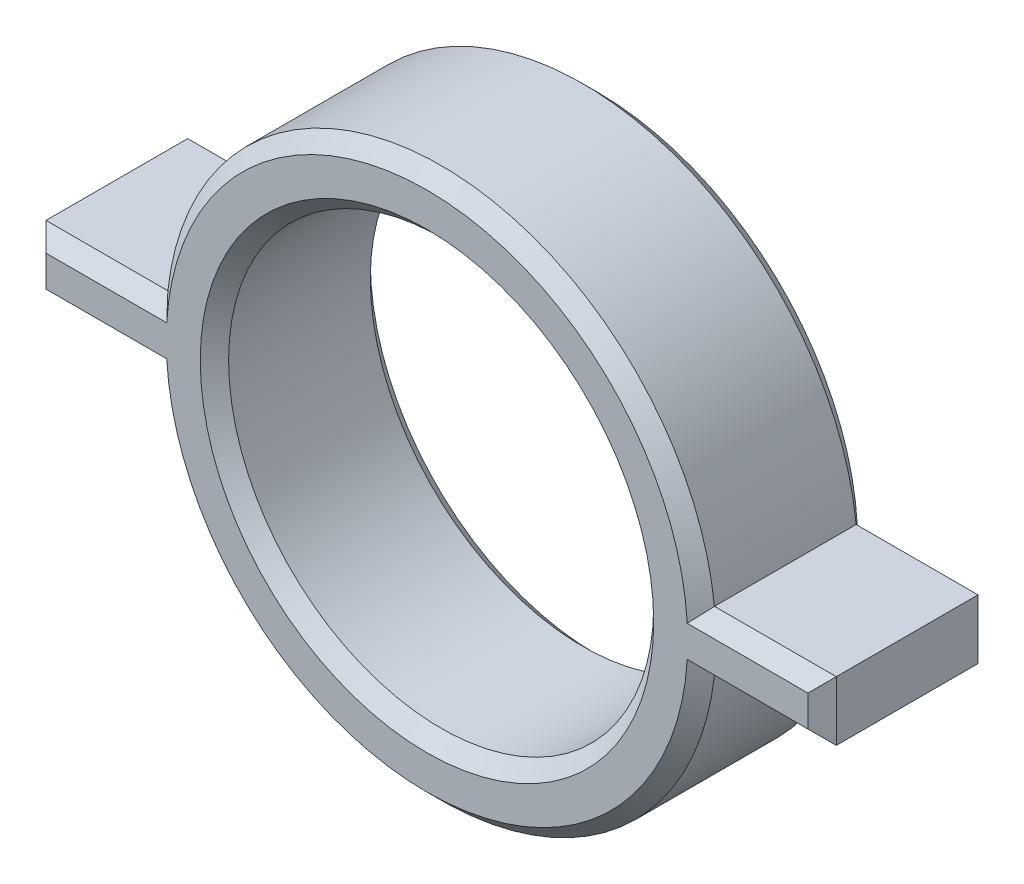
ISO-10303-21;
HEADER;
FILE_DESCRIPTION(('STEP AP214'),'2;1');
FILE_NAME('part.step','',(''),(''),'','','');
FILE_SCHEMA(('AUTOMOTIVE_DESIGN { 1 0 10303 214 1 1 1 1 }'));
ENDSEC;
DATA;
#1=APPLICATION_CONTEXT('core data for automotive mechanical design processes');
#2=APPLICATION_PROTOCOL_DEFINITION('international standard','automotive_design',2000,#1);
#3=PRODUCT_CONTEXT('',#1,'mechanical');
#4=PRODUCT('Part','Part','',(#3));
#5=PRODUCT_RELATED_PRODUCT_CATEGORY('part','',(#4));
#6=PRODUCT_DEFINITION_FORMATION('','',#4);
#7=PRODUCT_DEFINITION_CONTEXT('part definition',#1,'design');
#8=PRODUCT_DEFINITION('design','',#6,#7);
#9=PRODUCT_DEFINITION_SHAPE('','',#8);
#10=(LENGTH_UNIT() NAMED_UNIT(*) SI_UNIT(.MILLI.,.METRE.));
#11=(NAMED_UNIT(*) PLANE_ANGLE_UNIT() SI_UNIT($,.RADIAN.));
#12=(NAMED_UNIT(*) SI_UNIT($,.STERADIAN.) SOLID_ANGLE_UNIT());
#13=UNCERTAINTY_MEASURE_WITH_UNIT(LENGTH_MEASURE(1.E-05),#10,'distance_accuracy_value','');
#14=(GEOMETRIC_REPRESENTATION_CONTEXT(3) GLOBAL_UNCERTAINTY_ASSIGNED_CONTEXT((#13)) GLOBAL_UNIT_ASSIGNED_CONTEXT((#10,
#11,#12)) REPRESENTATION_CONTEXT('',''));
#15=CARTESIAN_POINT('',(0.,0.,0.));
#16=DIRECTION('',(0.,0.,1.));
#17=DIRECTION('',(1.,0.,0.));
#18=AXIS2_PLACEMENT_3D('',#15,#16,#17);
#19=CARTESIAN_POINT('',(0.,0.,6.));
#20=DIRECTION('',(0.,0.,1.));
#21=DIRECTION('',(1.,0.,0.));
#22=AXIS2_PLACEMENT_3D('',#19,#20,#21);
#23=PLANE('',#22);
#24=CARTESIAN_POINT('',(0.,0.,6.));
#25=DIRECTION('',(0.,0.,1.));
#26=DIRECTION('',(1.,0.,0.));
#27=AXIS2_PLACEMENT_3D('',#24,#25,#26);
#28=CIRCLE('',#27,8.00000000000001);
#29=CARTESIAN_POINT('',(8.00000000000001,0.,6.));
#30=VERTEX_POINT('',#29);
#31=EDGE_CURVE('E182',#30,#30,#28,.F.);
#32=ORIENTED_EDGE('',*,*,#31,.T.);
#33=EDGE_LOOP('',(#32));
#34=FACE_BOUND('',#33,.T.);
#35=DIRECTION('',(-1.,0.,0.));
#36=VECTOR('',#35,1.);
#37=CARTESIAN_POINT('',(9.6430026444049,0.550000000000006,6.));
#38=LINE('',#37,#36);
#39=CARTESIAN_POINT('',(13.4430026444049,0.550000000000006,6.));
#40=VERTEX_POINT('',#39);
#41=CARTESIAN_POINT('',(9.18354506712958,0.550000000000006,6.));
#42=VERTEX_POINT('',#41);
#43=EDGE_CURVE('E180',#40,#42,#38,.T.);
#44=ORIENTED_EDGE('',*,*,#43,.T.);
#45=CARTESIAN_POINT('',(0.,0.,6.));
#46=DIRECTION('',(0.,0.,1.));
#47=DIRECTION('',(1.,0.,0.));
#48=AXIS2_PLACEMENT_3D('',#45,#46,#47);
#49=CIRCLE('',#48,9.2);
#50=CARTESIAN_POINT('',(-9.18354506712958,0.550000000000004,6.));
#51=VERTEX_POINT('',#50);
#52=EDGE_CURVE('E162',#42,#51,#49,.T.);
#53=ORIENTED_EDGE('',*,*,#52,.T.);
#54=DIRECTION('',(-1.,0.,0.));
#55=VECTOR('',#54,1.);
#56=CARTESIAN_POINT('',(-13.9430026444049,0.550000000000003,6.));
#57=LINE('',#56,#55);
#58=CARTESIAN_POINT('',(-13.4430026444049,0.550000000000003,6.));
#59=VERTEX_POINT('',#58);
#60=EDGE_CURVE('E170',#51,#59,#57,.T.);
#61=ORIENTED_EDGE('',*,*,#60,.T.);
#62=DIRECTION('',(0.,-1.,0.));
#63=VECTOR('',#62,1.);
#64=CARTESIAN_POINT('',(-13.4430026444049,-1.05,6.));
#65=LINE('',#64,#63);
#66=CARTESIAN_POINT('',(-13.4430026444049,-0.550000000000003,6.));
#67=VERTEX_POINT('',#66);
#68=EDGE_CURVE('E176',#59,#67,#65,.T.);
#69=ORIENTED_EDGE('',*,*,#68,.T.);
#70=DIRECTION('',(1.,0.,0.));
#71=VECTOR('',#70,1.);
#72=CARTESIAN_POINT('',(-9.6430026444049,-0.550000000000004,6.));
#73=LINE('',#72,#71);
#74=CARTESIAN_POINT('',(-9.18354506712958,-0.550000000000004,6.));
#75=VERTEX_POINT('',#74);
#76=EDGE_CURVE('E445',#67,#75,#73,.T.);
#77=ORIENTED_EDGE('',*,*,#76,.T.);
#78=CARTESIAN_POINT('',(0.,0.,6.));
#79=DIRECTION('',(0.,0.,1.));
#80=DIRECTION('',(1.,0.,0.));
#81=AXIS2_PLACEMENT_3D('',#78,#79,#80);
#82=CIRCLE('',#81,9.2);
#83=CARTESIAN_POINT('',(9.18354506712958,-0.550000000000007,6.));
#84=VERTEX_POINT('',#83);
#85=EDGE_CURVE('E447',#75,#84,#82,.T.);
#86=ORIENTED_EDGE('',*,*,#85,.T.);
#87=DIRECTION('',(1.,0.,0.));
#88=VECTOR('',#87,1.);
#89=CARTESIAN_POINT('',(13.9430026444049,-0.55,6.));
#90=LINE('',#89,#88);
#91=CARTESIAN_POINT('',(13.4430026444049,-0.55,6.));
#92=VERTEX_POINT('',#91);
#93=EDGE_CURVE('E449',#84,#92,#90,.T.);
#94=ORIENTED_EDGE('',*,*,#93,.T.);
#95=DIRECTION('',(0.,1.,0.));
#96=VECTOR('',#95,1.);
#97=CARTESIAN_POINT('',(13.4430026444049,1.05,6.));
#98=LINE('',#97,#96);
#99=EDGE_CURVE('E187',#92,#40,#98,.T.);
#100=ORIENTED_EDGE('',*,*,#99,.T.);
#101=EDGE_LOOP('',(#44,#53,#61,#69,#77,#86,#94,#100));
#102=FACE_BOUND('',#101,.T.);
#103=ADVANCED_FACE('F41',(#34,#102),#23,.T.);
#104=CARTESIAN_POINT('',(0.,0.,0.));
#105=DIRECTION('',(0.,0.,1.));
#106=DIRECTION('',(1.,0.,0.));
#107=AXIS2_PLACEMENT_3D('',#104,#105,#106);
#108=PLANE('',#107);
#109=CARTESIAN_POINT('',(0.,0.,0.));
#110=DIRECTION('',(0.,0.,1.));
#111=DIRECTION('',(1.,0.,0.));
#112=AXIS2_PLACEMENT_3D('',#109,#110,#111);
#113=CIRCLE('',#112,7.99999999999999);
#114=CARTESIAN_POINT('',(7.99999999999999,0.,0.));
#115=VERTEX_POINT('',#114);
#116=EDGE_CURVE('E11',#115,#115,#113,.T.);
#117=ORIENTED_EDGE('',*,*,#116,.T.);
#118=EDGE_LOOP('',(#117));
#119=FACE_BOUND('',#118,.T.);
#120=DIRECTION('',(-1.,0.,0.));
#121=VECTOR('',#120,1.);
#122=CARTESIAN_POINT('',(0.,-0.550000000000005,0.));
#123=LINE('',#122,#121);
#124=CARTESIAN_POINT('',(-9.18354506712958,-0.550000000000004,0.));
#125=VERTEX_POINT('',#124);
#126=CARTESIAN_POINT('',(-13.4430026444049,-0.550000000000003,0.));
#127=VERTEX_POINT('',#126);
#128=EDGE_CURVE('E59',#125,#127,#123,.T.);
#129=ORIENTED_EDGE('',*,*,#128,.T.);
#130=DIRECTION('',(0.,1.,0.));
#131=VECTOR('',#130,1.);
#132=CARTESIAN_POINT('',(-13.4430026444049,0.,0.));
#133=LINE('',#132,#131);
#134=CARTESIAN_POINT('',(-13.4430026444049,0.550000000000003,0.));
#135=VERTEX_POINT('',#134);
#136=EDGE_CURVE('E51',#127,#135,#133,.T.);
#137=ORIENTED_EDGE('',*,*,#136,.T.);
#138=DIRECTION('',(1.,0.,0.));
#139=VECTOR('',#138,1.);
#140=CARTESIAN_POINT('',(0.,0.550000000000005,0.));
#141=LINE('',#140,#139);
#142=CARTESIAN_POINT('',(-9.18354506712958,0.550000000000004,0.));
#143=VERTEX_POINT('',#142);
#144=EDGE_CURVE('E222',#135,#143,#141,.T.);
#145=ORIENTED_EDGE('',*,*,#144,.T.);
#146=CARTESIAN_POINT('',(0.,0.,0.));
#147=DIRECTION('',(0.,0.,1.));
#148=DIRECTION('',(1.,0.,0.));
#149=AXIS2_PLACEMENT_3D('',#146,#147,#148);
#150=CIRCLE('',#149,9.2);
#151=CARTESIAN_POINT('',(9.18354506712958,0.550000000000006,0.));
#152=VERTEX_POINT('',#151);
#153=EDGE_CURVE('E224',#143,#152,#150,.F.);
#154=ORIENTED_EDGE('',*,*,#153,.T.);
#155=DIRECTION('',(1.,0.,0.));
#156=VECTOR('',#155,1.);
#157=CARTESIAN_POINT('',(0.,0.550000000000005,0.));
#158=LINE('',#157,#156);
#159=CARTESIAN_POINT('',(13.4430026444049,0.550000000000006,0.));
#160=VERTEX_POINT('',#159);
#161=EDGE_CURVE('E226',#152,#160,#158,.T.);
#162=ORIENTED_EDGE('',*,*,#161,.T.);
#163=DIRECTION('',(0.,-1.,0.));
#164=VECTOR('',#163,1.);
#165=CARTESIAN_POINT('',(13.4430026444049,0.,0.));
#166=LINE('',#165,#164);
#167=CARTESIAN_POINT('',(13.4430026444049,-0.55,0.));
#168=VERTEX_POINT('',#167);
#169=EDGE_CURVE('E228',#160,#168,#166,.T.);
#170=ORIENTED_EDGE('',*,*,#169,.T.);
#171=DIRECTION('',(-1.,0.,0.));
#172=VECTOR('',#171,1.);
#173=CARTESIAN_POINT('',(0.,-0.55000000000002,0.));
#174=LINE('',#173,#172);
#175=CARTESIAN_POINT('',(9.18354506712958,-0.550000000000007,0.));
#176=VERTEX_POINT('',#175);
#177=EDGE_CURVE('E230',#168,#176,#174,.T.);
#178=ORIENTED_EDGE('',*,*,#177,.T.);
#179=CARTESIAN_POINT('',(0.,0.,0.));
#180=DIRECTION('',(0.,0.,1.));
#181=DIRECTION('',(1.,0.,0.));
#182=AXIS2_PLACEMENT_3D('',#179,#180,#181);
#183=CIRCLE('',#182,9.2);
#184=EDGE_CURVE('E64',#176,#125,#183,.F.);
#185=ORIENTED_EDGE('',*,*,#184,.T.);
#186=EDGE_LOOP('',(#129,#137,#145,#154,#162,#170,#178,#185));
#187=FACE_BOUND('',#186,.T.);
#188=ADVANCED_FACE('F411',(#119,#187),#108,.F.);
#189=CARTESIAN_POINT('',(-9.6430026444049,1.05,6.));
#190=DIRECTION('',(0.,-1.,0.));
#191=DIRECTION('',(1.,0.,0.));
#192=AXIS2_PLACEMENT_3D('',#189,#190,#191);
#193=PLANE('',#192);
#194=DIRECTION('',(0.,0.,-1.));
#195=VECTOR('',#194,1.);
#196=CARTESIAN_POINT('',(-13.9430026444049,1.05,6.));
#197=LINE('',#196,#195);
#198=CARTESIAN_POINT('',(-13.9430026444049,1.05,5.5));
#199=VERTEX_POINT('',#198);
#200=CARTESIAN_POINT('',(-13.9430026444049,1.05,0.499999999999997));
#201=VERTEX_POINT('',#200);
#202=EDGE_CURVE('E426',#199,#201,#197,.T.);
#203=ORIENTED_EDGE('',*,*,#202,.F.);
#204=DIRECTION('',(1.,0.,0.));
#205=VECTOR('',#204,1.);
#206=CARTESIAN_POINT('',(-9.6430026444049,1.05,5.5));
#207=LINE('',#206,#205);
#208=CARTESIAN_POINT('',(-9.6430026444049,1.05,5.5));
#209=VERTEX_POINT('',#208);
#210=EDGE_CURVE('E220',#199,#209,#207,.T.);
#211=ORIENTED_EDGE('',*,*,#210,.T.);
#212=DIRECTION('',(0.,0.,-1.));
#213=VECTOR('',#212,1.);
#214=CARTESIAN_POINT('',(-9.6430026444049,1.05,6.));
#215=LINE('',#214,#213);
#216=CARTESIAN_POINT('',(-9.6430026444049,1.05,0.499999999999997));
#217=VERTEX_POINT('',#216);
#218=EDGE_CURVE('E307',#209,#217,#215,.T.);
#219=ORIENTED_EDGE('',*,*,#218,.T.);
#220=DIRECTION('',(-1.,0.,0.));
#221=VECTOR('',#220,1.);
#222=CARTESIAN_POINT('',(-9.6430026444049,1.05,0.499999999999997));
#223=LINE('',#222,#221);
#224=EDGE_CURVE('E218',#217,#201,#223,.T.);
#225=ORIENTED_EDGE('',*,*,#224,.T.);
#226=EDGE_LOOP('',(#203,#211,#219,#225));
#227=FACE_BOUND('',#226,.T.);
#228=ADVANCED_FACE('F425',(#227),#193,.F.);
#229=CARTESIAN_POINT('',(-13.9430026444049,1.05,6.));
#230=DIRECTION('',(1.,0.,0.));
#231=DIRECTION('',(0.,0.,-1.));
#232=AXIS2_PLACEMENT_3D('',#229,#230,#231);
#233=PLANE('',#232);
#234=DIRECTION('',(0.,0.,-1.));
#235=VECTOR('',#234,1.);
#236=CARTESIAN_POINT('',(-13.9430026444049,-1.05,6.));
#237=LINE('',#236,#235);
#238=CARTESIAN_POINT('',(-13.9430026444049,-1.05,5.5));
#239=VERTEX_POINT('',#238);
#240=CARTESIAN_POINT('',(-13.9430026444049,-1.05,0.499999999999997));
#241=VERTEX_POINT('',#240);
#242=EDGE_CURVE('E434',#239,#241,#237,.T.);
#243=ORIENTED_EDGE('',*,*,#242,.F.);
#244=DIRECTION('',(0.,1.,0.));
#245=VECTOR('',#244,1.);
#246=CARTESIAN_POINT('',(-13.9430026444049,1.05,5.5));
#247=LINE('',#246,#245);
#248=EDGE_CURVE('E216',#239,#199,#247,.T.);
#249=ORIENTED_EDGE('',*,*,#248,.T.);
#250=ORIENTED_EDGE('',*,*,#202,.T.);
#251=DIRECTION('',(0.,-1.,0.));
#252=VECTOR('',#251,1.);
#253=CARTESIAN_POINT('',(-13.9430026444049,1.05,0.499999999999997));
#254=LINE('',#253,#252);
#255=EDGE_CURVE('E213',#201,#241,#254,.T.);
#256=ORIENTED_EDGE('',*,*,#255,.T.);
#257=EDGE_LOOP('',(#243,#249,#250,#256));
#258=FACE_BOUND('',#257,.T.);
#259=ADVANCED_FACE('F430',(#258),#233,.F.);
#260=CARTESIAN_POINT('',(-13.9430026444049,-1.05,6.));
#261=DIRECTION('',(0.,1.,0.));
#262=DIRECTION('',(-1.,0.,0.));
#263=AXIS2_PLACEMENT_3D('',#260,#261,#262);
#264=PLANE('',#263);
#265=DIRECTION('',(0.,0.,-1.));
#266=VECTOR('',#265,1.);
#267=CARTESIAN_POINT('',(-9.6430026444049,-1.05,6.));
#268=LINE('',#267,#266);
#269=CARTESIAN_POINT('',(-9.6430026444049,-1.05,5.5));
#270=VERTEX_POINT('',#269);
#271=CARTESIAN_POINT('',(-9.6430026444049,-1.05,0.499999999999997));
#272=VERTEX_POINT('',#271);
#273=EDGE_CURVE('E438',#270,#272,#268,.T.);
#274=ORIENTED_EDGE('',*,*,#273,.F.);
#275=DIRECTION('',(-1.,0.,0.));
#276=VECTOR('',#275,1.);
#277=CARTESIAN_POINT('',(-13.9430026444049,-1.05,5.5));
#278=LINE('',#277,#276);
#279=EDGE_CURVE('E211',#270,#239,#278,.T.);
#280=ORIENTED_EDGE('',*,*,#279,.T.);
#281=ORIENTED_EDGE('',*,*,#242,.T.);
#282=DIRECTION('',(1.,0.,0.));
#283=VECTOR('',#282,1.);
#284=CARTESIAN_POINT('',(-13.9430026444049,-1.05,0.499999999999997));
#285=LINE('',#284,#283);
#286=EDGE_CURVE('E209',#241,#272,#285,.T.);
#287=ORIENTED_EDGE('',*,*,#286,.T.);
#288=EDGE_LOOP('',(#274,#280,#281,#287));
#289=FACE_BOUND('',#288,.T.);
#290=ADVANCED_FACE('F500',(#289),#264,.F.);
#291=CARTESIAN_POINT('',(0.,0.,6.));
#292=DIRECTION('',(0.,0.,-1.));
#293=DIRECTION('',(-1.,0.,0.));
#294=AXIS2_PLACEMENT_3D('',#291,#292,#293);
#295=CYLINDRICAL_SURFACE('',#294,9.7);
#296=DIRECTION('',(0.,0.,-1.));
#297=VECTOR('',#296,1.);
#298=CARTESIAN_POINT('',(9.6430026444049,-1.05,6.));
#299=LINE('',#298,#297);
#300=CARTESIAN_POINT('',(9.6430026444049,-1.05,5.5));
#301=VERTEX_POINT('',#300);
#302=CARTESIAN_POINT('',(9.6430026444049,-1.05,0.499999999999997));
#303=VERTEX_POINT('',#302);
#304=EDGE_CURVE('E487',#301,#303,#299,.T.);
#305=ORIENTED_EDGE('',*,*,#304,.F.);
#306=CARTESIAN_POINT('',(0.,0.,5.5));
#307=DIRECTION('',(0.,0.,1.));
#308=DIRECTION('',(1.,0.,0.));
#309=AXIS2_PLACEMENT_3D('',#306,#307,#308);
#310=CIRCLE('',#309,9.7);
#311=EDGE_CURVE('E207',#301,#270,#310,.F.);
#312=ORIENTED_EDGE('',*,*,#311,.T.);
#313=ORIENTED_EDGE('',*,*,#273,.T.);
#314=CARTESIAN_POINT('',(0.,0.,0.499999999999997));
#315=DIRECTION('',(0.,0.,1.));
#316=DIRECTION('',(1.,0.,0.));
#317=AXIS2_PLACEMENT_3D('',#314,#315,#316);
#318=CIRCLE('',#317,9.7);
#319=EDGE_CURVE('E205',#272,#303,#318,.T.);
#320=ORIENTED_EDGE('',*,*,#319,.T.);
#321=EDGE_LOOP('',(#305,#312,#313,#320));
#322=FACE_BOUND('',#321,.T.);
#323=ADVANCED_FACE('F494',(#322),#295,.T.);
#324=CARTESIAN_POINT('',(9.6430026444049,-1.05,6.));
#325=DIRECTION('',(0.,1.,0.));
#326=DIRECTION('',(-1.,0.,0.));
#327=AXIS2_PLACEMENT_3D('',#324,#325,#326);
#328=PLANE('',#327);
#329=DIRECTION('',(0.,0.,-1.));
#330=VECTOR('',#329,1.);
#331=CARTESIAN_POINT('',(13.9430026444049,-1.05,6.));
#332=LINE('',#331,#330);
#333=CARTESIAN_POINT('',(13.9430026444049,-1.05,5.5));
#334=VERTEX_POINT('',#333);
#335=CARTESIAN_POINT('',(13.9430026444049,-1.05,0.499999999999997));
#336=VERTEX_POINT('',#335);
#337=EDGE_CURVE('E484',#334,#336,#332,.T.);
#338=ORIENTED_EDGE('',*,*,#337,.F.);
#339=DIRECTION('',(-1.,0.,0.));
#340=VECTOR('',#339,1.);
#341=CARTESIAN_POINT('',(9.6430026444049,-1.05,5.5));
#342=LINE('',#341,#340);
#343=EDGE_CURVE('E203',#334,#301,#342,.T.);
#344=ORIENTED_EDGE('',*,*,#343,.T.);
#345=ORIENTED_EDGE('',*,*,#304,.T.);
#346=DIRECTION('',(1.,0.,0.));
#347=VECTOR('',#346,1.);
#348=CARTESIAN_POINT('',(9.6430026444049,-1.05,0.499999999999997));
#349=LINE('',#348,#347);
#350=EDGE_CURVE('E201',#303,#336,#349,.T.);
#351=ORIENTED_EDGE('',*,*,#350,.T.);
#352=EDGE_LOOP('',(#338,#344,#345,#351));
#353=FACE_BOUND('',#352,.T.);
#354=ADVANCED_FACE('F507',(#353),#328,.F.);
#355=CARTESIAN_POINT('',(13.9430026444049,-1.05,6.));
#356=DIRECTION('',(-1.,0.,0.));
#357=DIRECTION('',(0.,0.,1.));
#358=AXIS2_PLACEMENT_3D('',#355,#356,#357);
#359=PLANE('',#358);
#360=DIRECTION('',(0.,0.,-1.));
#361=VECTOR('',#360,1.);
#362=CARTESIAN_POINT('',(13.9430026444049,1.05,6.));
#363=LINE('',#362,#361);
#364=CARTESIAN_POINT('',(13.9430026444049,1.05,5.5));
#365=VERTEX_POINT('',#364);
#366=CARTESIAN_POINT('',(13.9430026444049,1.05,0.499999999999997));
#367=VERTEX_POINT('',#366);
#368=EDGE_CURVE('E479',#365,#367,#363,.T.);
#369=ORIENTED_EDGE('',*,*,#368,.F.);
#370=DIRECTION('',(0.,-1.,0.));
#371=VECTOR('',#370,1.);
#372=CARTESIAN_POINT('',(13.9430026444049,-1.05,5.5));
#373=LINE('',#372,#371);
#374=EDGE_CURVE('E199',#365,#334,#373,.T.);
#375=ORIENTED_EDGE('',*,*,#374,.T.);
#376=ORIENTED_EDGE('',*,*,#337,.T.);
#377=DIRECTION('',(0.,1.,0.));
#378=VECTOR('',#377,1.);
#379=CARTESIAN_POINT('',(13.9430026444049,-1.05,0.499999999999997));
#380=LINE('',#379,#378);
#381=EDGE_CURVE('E197',#336,#367,#380,.T.);
#382=ORIENTED_EDGE('',*,*,#381,.T.);
#383=EDGE_LOOP('',(#369,#375,#376,#382));
#384=FACE_BOUND('',#383,.T.);
#385=ADVANCED_FACE('F526',(#384),#359,.F.);
#386=CARTESIAN_POINT('',(13.9430026444049,1.05,6.));
#387=DIRECTION('',(0.,-1.,0.));
#388=DIRECTION('',(1.,0.,0.));
#389=AXIS2_PLACEMENT_3D('',#386,#387,#388);
#390=PLANE('',#389);
#391=DIRECTION('',(0.,0.,-1.));
#392=VECTOR('',#391,1.);
#393=CARTESIAN_POINT('',(9.6430026444049,1.05,6.));
#394=LINE('',#393,#392);
#395=CARTESIAN_POINT('',(9.6430026444049,1.05,5.5));
#396=VERTEX_POINT('',#395);
#397=CARTESIAN_POINT('',(9.6430026444049,1.05,0.499999999999997));
#398=VERTEX_POINT('',#397);
#399=EDGE_CURVE('E477',#396,#398,#394,.T.);
#400=ORIENTED_EDGE('',*,*,#399,.F.);
#401=DIRECTION('',(1.,0.,0.));
#402=VECTOR('',#401,1.);
#403=CARTESIAN_POINT('',(13.9430026444049,1.05,5.5));
#404=LINE('',#403,#402);
#405=EDGE_CURVE('E195',#396,#365,#404,.T.);
#406=ORIENTED_EDGE('',*,*,#405,.T.);
#407=ORIENTED_EDGE('',*,*,#368,.T.);
#408=DIRECTION('',(-1.,0.,0.));
#409=VECTOR('',#408,1.);
#410=CARTESIAN_POINT('',(13.9430026444049,1.05,0.499999999999997));
#411=LINE('',#410,#409);
#412=EDGE_CURVE('E193',#367,#398,#411,.T.);
#413=ORIENTED_EDGE('',*,*,#412,.T.);
#414=EDGE_LOOP('',(#400,#406,#407,#413));
#415=FACE_BOUND('',#414,.T.);
#416=ADVANCED_FACE('F523',(#415),#390,.F.);
#417=CARTESIAN_POINT('',(0.,0.,6.));
#418=DIRECTION('',(0.,0.,-1.));
#419=DIRECTION('',(-1.,0.,0.));
#420=AXIS2_PLACEMENT_3D('',#417,#418,#419);
#421=CYLINDRICAL_SURFACE('',#420,9.7);
#422=ORIENTED_EDGE('',*,*,#218,.F.);
#423=CARTESIAN_POINT('',(0.,0.,5.5));
#424=DIRECTION('',(0.,0.,1.));
#425=DIRECTION('',(1.,0.,0.));
#426=AXIS2_PLACEMENT_3D('',#423,#424,#425);
#427=CIRCLE('',#426,9.7);
#428=EDGE_CURVE('E164',#209,#396,#427,.F.);
#429=ORIENTED_EDGE('',*,*,#428,.T.);
#430=ORIENTED_EDGE('',*,*,#399,.T.);
#431=CARTESIAN_POINT('',(0.,0.,0.499999999999997));
#432=DIRECTION('',(0.,0.,1.));
#433=DIRECTION('',(1.,0.,0.));
#434=AXIS2_PLACEMENT_3D('',#431,#432,#433);
#435=CIRCLE('',#434,9.7);
#436=EDGE_CURVE('E185',#398,#217,#435,.T.);
#437=ORIENTED_EDGE('',*,*,#436,.T.);
#438=EDGE_LOOP('',(#422,#429,#430,#437));
#439=FACE_BOUND('',#438,.T.);
#440=ADVANCED_FACE('F474',(#439),#421,.T.);
#441=CARTESIAN_POINT('',(0.,0.,6.));
#442=DIRECTION('',(0.,0.,-1.));
#443=DIRECTION('',(-1.,0.,0.));
#444=AXIS2_PLACEMENT_3D('',#441,#442,#443);
#445=CYLINDRICAL_SURFACE('',#444,7.5);
#446=CARTESIAN_POINT('',(0.,0.,5.49999999999999));
#447=DIRECTION('',(0.,0.,1.));
#448=DIRECTION('',(1.,0.,0.));
#449=AXIS2_PLACEMENT_3D('',#446,#447,#448);
#450=CIRCLE('',#449,7.5);
#451=CARTESIAN_POINT('',(7.5,0.,5.49999999999999));
#452=VERTEX_POINT('',#451);
#453=EDGE_CURVE('E177',#452,#452,#450,.T.);
#454=ORIENTED_EDGE('',*,*,#453,.T.);
#455=EDGE_LOOP('',(#454));
#456=FACE_BOUND('',#455,.T.);
#457=CARTESIAN_POINT('',(0.,0.,0.499999999999992));
#458=DIRECTION('',(0.,0.,1.));
#459=DIRECTION('',(1.,0.,0.));
#460=AXIS2_PLACEMENT_3D('',#457,#458,#459);
#461=CIRCLE('',#460,7.5);
#462=CARTESIAN_POINT('',(7.5,0.,0.499999999999992));
#463=VERTEX_POINT('',#462);
#464=EDGE_CURVE('E433',#463,#463,#461,.F.);
#465=ORIENTED_EDGE('',*,*,#464,.T.);
#466=EDGE_LOOP('',(#465));
#467=FACE_BOUND('',#466,.T.);
#468=ADVANCED_FACE('F519',(#456,#467),#445,.F.);
#469=CARTESIAN_POINT('',(0.,0.,5.49999999999999));
#470=DIRECTION('',(0.,0.,1.));
#471=DIRECTION('',(1.,0.,0.));
#472=AXIS2_PLACEMENT_3D('',#469,#470,#471);
#473=CONICAL_SURFACE('',#472,7.5,0.785398163397449);
#474=ORIENTED_EDGE('',*,*,#31,.F.);
#475=EDGE_LOOP('',(#474));
#476=FACE_BOUND('',#475,.T.);
#477=ORIENTED_EDGE('',*,*,#453,.F.);
#478=EDGE_LOOP('',(#477));
#479=FACE_BOUND('',#478,.T.);
#480=ADVANCED_FACE('F287',(#476,#479),#473,.F.);
#481=CARTESIAN_POINT('',(0.,0.,6.));
#482=DIRECTION('',(0.,0.,-1.));
#483=DIRECTION('',(-1.,0.,0.));
#484=AXIS2_PLACEMENT_3D('',#481,#482,#483);
#485=CONICAL_SURFACE('',#484,9.2,0.785398163397448);
#486=CARTESIAN_POINT('',(-9.6430026444049,-1.05,5.5));
#487=CARTESIAN_POINT('',(-9.56774038324807,-0.96606303608775,5.58393696391225));
#488=CARTESIAN_POINT('',(-9.49182115325673,-0.882427921481516,5.66757207851849));
#489=CARTESIAN_POINT('',(-9.33866862965934,-0.715761253821939,5.83423874617807));
#490=CARTESIAN_POINT('',(-9.26143533389224,-0.632729701761507,5.9172702982385));
#491=CARTESIAN_POINT('',(-9.18354506712958,-0.550000000000002,6.));
#492=B_SPLINE_CURVE_WITH_KNOTS('',3,(#486,#487,#488,#489,#490,#491),.UNSPECIFIED.,.F.,.F.,(4,2,
4),(0.,0.42164030696301,0.843281307402478),.UNSPECIFIED.);
#493=EDGE_CURVE('E293',#270,#75,#492,.T.);
#494=ORIENTED_EDGE('',*,*,#493,.F.);
#495=ORIENTED_EDGE('',*,*,#311,.F.);
#496=CARTESIAN_POINT('',(9.6430026444049,-1.05,5.5));
#497=CARTESIAN_POINT('',(9.56774038324807,-0.966063036087752,5.58393696391225));
#498=CARTESIAN_POINT('',(9.49182115325673,-0.882427921481517,5.66757207851849));
#499=CARTESIAN_POINT('',(9.33866862965934,-0.715761253821941,5.83423874617807));
#500=CARTESIAN_POINT('',(9.26143533389223,-0.63272970176151,5.9172702982385));
#501=CARTESIAN_POINT('',(9.18354506712958,-0.550000000000005,6.));
#502=B_SPLINE_CURVE_WITH_KNOTS('',3,(#496,#497,#498,#499,#500,#501),.UNSPECIFIED.,.F.,.F.,(4,2,
4),(0.,0.421640306963012,0.843281307402478),.UNSPECIFIED.);
#503=EDGE_CURVE('E300',#84,#301,#502,.F.);
#504=ORIENTED_EDGE('',*,*,#503,.F.);
#505=ORIENTED_EDGE('',*,*,#85,.F.);
#506=EDGE_LOOP('',(#494,#495,#504,#505));
#507=FACE_BOUND('',#506,.T.);
#508=ADVANCED_FACE('F279',(#507),#485,.T.);
#509=CARTESIAN_POINT('',(0.,-0.55000000000002,6.));
#510=DIRECTION('',(0.,-0.707106781186547,0.707106781186547));
#511=DIRECTION('',(-1.,0.,0.));
#512=AXIS2_PLACEMENT_3D('',#509,#510,#511);
#513=PLANE('',#512);
#514=ORIENTED_EDGE('',*,*,#503,.T.);
#515=ORIENTED_EDGE('',*,*,#343,.F.);
#516=DIRECTION('',(-0.577350269189626,0.577350269189625,0.577350269189626));
#517=VECTOR('',#516,1.);
#518=CARTESIAN_POINT('',(8.96200176293661,3.93100088146829,10.4810008814683));
#519=LINE('',#518,#517);
#520=EDGE_CURVE('E463',#92,#334,#519,.F.);
#521=ORIENTED_EDGE('',*,*,#520,.F.);
#522=ORIENTED_EDGE('',*,*,#93,.F.);
#523=EDGE_LOOP('',(#514,#515,#521,#522));
#524=FACE_BOUND('',#523,.T.);
#525=ADVANCED_FACE('F286',(#524),#513,.T.);
#526=CARTESIAN_POINT('',(0.,-0.550000000000005,6.));
#527=DIRECTION('',(0.,-0.707106781186547,0.707106781186547));
#528=DIRECTION('',(-1.,0.,0.));
#529=AXIS2_PLACEMENT_3D('',#526,#527,#528);
#530=PLANE('',#529);
#531=ORIENTED_EDGE('',*,*,#493,.T.);
#532=ORIENTED_EDGE('',*,*,#76,.F.);
#533=DIRECTION('',(0.577350269189626,0.577350269189626,0.577350269189626));
#534=VECTOR('',#533,1.);
#535=CARTESIAN_POINT('',(-13.2596693110716,-0.366666666666669,6.18333333333333));
#536=LINE('',#535,#534);
#537=EDGE_CURVE('E459',#239,#67,#536,.T.);
#538=ORIENTED_EDGE('',*,*,#537,.F.);
#539=ORIENTED_EDGE('',*,*,#279,.F.);
#540=EDGE_LOOP('',(#531,#532,#538,#539));
#541=FACE_BOUND('',#540,.T.);
#542=ADVANCED_FACE('F277',(#541),#530,.T.);
#543=CARTESIAN_POINT('',(13.4430026444049,0.,6.));
#544=DIRECTION('',(0.707106781186547,0.,0.707106781186547));
#545=DIRECTION('',(0.,-1.,0.));
#546=AXIS2_PLACEMENT_3D('',#543,#544,#545);
#547=PLANE('',#546);
#548=ORIENTED_EDGE('',*,*,#520,.T.);
#549=ORIENTED_EDGE('',*,*,#374,.F.);
#550=DIRECTION('',(-0.577350269189626,-0.577350269189626,0.577350269189626));
#551=VECTOR('',#550,1.);
#552=CARTESIAN_POINT('',(13.2596693110716,0.366666666666671,6.18333333333334));
#553=LINE('',#552,#551);
#554=EDGE_CURVE('E457',#40,#365,#553,.F.);
#555=ORIENTED_EDGE('',*,*,#554,.F.);
#556=ORIENTED_EDGE('',*,*,#99,.F.);
#557=EDGE_LOOP('',(#548,#549,#555,#556));
#558=FACE_BOUND('',#557,.T.);
#559=ADVANCED_FACE('F270',(#558),#547,.T.);
#560=CARTESIAN_POINT('',(-13.4430026444049,0.,6.));
#561=DIRECTION('',(-0.707106781186547,0.,0.707106781186547));
#562=DIRECTION('',(0.,1.,0.));
#563=AXIS2_PLACEMENT_3D('',#560,#561,#562);
#564=PLANE('',#563);
#565=ORIENTED_EDGE('',*,*,#537,.T.);
#566=ORIENTED_EDGE('',*,*,#68,.F.);
#567=DIRECTION('',(0.577350269189626,-0.577350269189626,0.577350269189626));
#568=VECTOR('',#567,1.);
#569=CARTESIAN_POINT('',(-8.96200176293661,-3.9310008814683,10.4810008814683));
#570=LINE('',#569,#568);
#571=EDGE_CURVE('E173',#199,#59,#570,.T.);
#572=ORIENTED_EDGE('',*,*,#571,.F.);
#573=ORIENTED_EDGE('',*,*,#248,.F.);
#574=EDGE_LOOP('',(#565,#566,#572,#573));
#575=FACE_BOUND('',#574,.T.);
#576=ADVANCED_FACE('F263',(#575),#564,.T.);
#577=CARTESIAN_POINT('',(0.,0.550000000000005,6.));
#578=DIRECTION('',(0.,0.707106781186547,0.707106781186547));
#579=DIRECTION('',(1.,0.,0.));
#580=AXIS2_PLACEMENT_3D('',#577,#578,#579);
#581=PLANE('',#580);
#582=ORIENTED_EDGE('',*,*,#554,.T.);
#583=ORIENTED_EDGE('',*,*,#405,.F.);
#584=CARTESIAN_POINT('',(9.6430026444049,1.05,5.5));
#585=CARTESIAN_POINT('',(9.56774038324807,0.966063036087752,5.58393696391225));
#586=CARTESIAN_POINT('',(9.49182115325673,0.882427921481517,5.66757207851849));
#587=CARTESIAN_POINT('',(9.33866862965934,0.715761253821941,5.83423874617807));
#588=CARTESIAN_POINT('',(9.26143533389223,0.632729701761509,5.9172702982385));
#589=CARTESIAN_POINT('',(9.18354506712958,0.550000000000004,6.));
#590=B_SPLINE_CURVE_WITH_KNOTS('',3,(#584,#585,#586,#587,#588,#589),.UNSPECIFIED.,.F.,.F.,(4,2,
4),(0.,0.421640306963012,0.843281307402479),.UNSPECIFIED.);
#591=EDGE_CURVE('E167',#42,#396,#590,.F.);
#592=ORIENTED_EDGE('',*,*,#591,.F.);
#593=ORIENTED_EDGE('',*,*,#43,.F.);
#594=EDGE_LOOP('',(#582,#583,#592,#593));
#595=FACE_BOUND('',#594,.T.);
#596=ADVANCED_FACE('F256',(#595),#581,.T.);
#597=CARTESIAN_POINT('',(0.,0.550000000000005,6.));
#598=DIRECTION('',(0.,0.707106781186547,0.707106781186547));
#599=DIRECTION('',(1.,0.,0.));
#600=AXIS2_PLACEMENT_3D('',#597,#598,#599);
#601=PLANE('',#600);
#602=ORIENTED_EDGE('',*,*,#571,.T.);
#603=ORIENTED_EDGE('',*,*,#60,.F.);
#604=CARTESIAN_POINT('',(-9.18354506712958,0.550000000000004,6.));
#605=CARTESIAN_POINT('',(-9.26143533389223,0.632729701761509,5.9172702982385));
#606=CARTESIAN_POINT('',(-9.33866862965934,0.71576125382194,5.83423874617806));
#607=CARTESIAN_POINT('',(-9.49182115325673,0.882427921481515,5.66757207851849));
#608=CARTESIAN_POINT('',(-9.56774038324807,0.966063036087749,5.58393696391226));
#609=CARTESIAN_POINT('',(-9.64300264440491,1.05,5.50000000000001));
#610=B_SPLINE_CURVE_WITH_KNOTS('',3,(#604,#605,#606,#607,#608,#609),.UNSPECIFIED.,.F.,.F.,(4,2,
4),(0.,0.421641000439468,0.843281307402478),.UNSPECIFIED.);
#611=EDGE_CURVE('E158',#209,#51,#610,.F.);
#612=ORIENTED_EDGE('',*,*,#611,.F.);
#613=ORIENTED_EDGE('',*,*,#210,.F.);
#614=EDGE_LOOP('',(#602,#603,#612,#613));
#615=FACE_BOUND('',#614,.T.);
#616=ADVANCED_FACE('F171',(#615),#601,.T.);
#617=CARTESIAN_POINT('',(0.,0.,6.));
#618=DIRECTION('',(0.,0.,-1.));
#619=DIRECTION('',(-1.,0.,0.));
#620=AXIS2_PLACEMENT_3D('',#617,#618,#619);
#621=CONICAL_SURFACE('',#620,9.2,0.785398163397448);
#622=ORIENTED_EDGE('',*,*,#591,.T.);
#623=ORIENTED_EDGE('',*,*,#428,.F.);
#624=ORIENTED_EDGE('',*,*,#611,.T.);
#625=ORIENTED_EDGE('',*,*,#52,.F.);
#626=EDGE_LOOP('',(#622,#623,#624,#625));
#627=FACE_BOUND('',#626,.T.);
#628=ADVANCED_FACE('F160',(#627),#621,.T.);
#629=CARTESIAN_POINT('',(0.,0.,0.));
#630=DIRECTION('',(0.,0.,-1.));
#631=DIRECTION('',(-1.,0.,0.));
#632=AXIS2_PLACEMENT_3D('',#629,#630,#631);
#633=CONICAL_SURFACE('',#632,7.99999999999999,0.78539816339745);
#634=ORIENTED_EDGE('',*,*,#464,.F.);
#635=EDGE_LOOP('',(#634));
#636=FACE_BOUND('',#635,.T.);
#637=ORIENTED_EDGE('',*,*,#116,.F.);
#638=EDGE_LOOP('',(#637));
#639=FACE_BOUND('',#638,.T.);
#640=ADVANCED_FACE('F319',(#636,#639),#633,.F.);
#641=CARTESIAN_POINT('',(13.9430026444049,-1.05,0.499999999999997));
#642=DIRECTION('',(-0.707106781186547,0.,0.707106781186547));
#643=DIRECTION('',(0.,1.,0.));
#644=AXIS2_PLACEMENT_3D('',#641,#642,#643);
#645=PLANE('',#644);
#646=DIRECTION('',(-0.577350269189626,0.577350269189625,-0.577350269189626));
#647=VECTOR('',#646,1.);
#648=CARTESIAN_POINT('',(13.9430026444049,-1.05,0.499999999999997));
#649=LINE('',#648,#647);
#650=EDGE_CURVE('E398',#168,#336,#649,.F.);
#651=ORIENTED_EDGE('',*,*,#650,.F.);
#652=ORIENTED_EDGE('',*,*,#169,.F.);
#653=DIRECTION('',(-0.577350269189626,-0.577350269189626,-0.577350269189626));
#654=VECTOR('',#653,1.);
#655=CARTESIAN_POINT('',(13.9430026444049,1.05,0.499999999999997));
#656=LINE('',#655,#654);
#657=EDGE_CURVE('E46',#367,#160,#656,.T.);
#658=ORIENTED_EDGE('',*,*,#657,.F.);
#659=ORIENTED_EDGE('',*,*,#381,.F.);
#660=EDGE_LOOP('',(#651,#652,#658,#659));
#661=FACE_BOUND('',#660,.T.);
#662=ADVANCED_FACE('F44',(#661),#645,.F.);
#663=CARTESIAN_POINT('',(13.9430026444049,1.05,0.499999999999997));
#664=DIRECTION('',(0.,-0.707106781186547,0.707106781186547));
#665=DIRECTION('',(-1.,0.,0.));
#666=AXIS2_PLACEMENT_3D('',#663,#664,#665);
#667=PLANE('',#666);
#668=ORIENTED_EDGE('',*,*,#657,.T.);
#669=ORIENTED_EDGE('',*,*,#161,.F.);
#670=CARTESIAN_POINT('',(9.6430026444049,1.05,0.499999999999997));
#671=CARTESIAN_POINT('',(9.56774038324807,0.966063036087752,0.416063036087746));
#672=CARTESIAN_POINT('',(9.49182115325673,0.882427921481517,0.332427921481511));
#673=CARTESIAN_POINT('',(9.33866862965934,0.715761253821941,0.165761253821935));
#674=CARTESIAN_POINT('',(9.26143533389223,0.632729701761509,0.0827297017615034));
#675=CARTESIAN_POINT('',(9.18354506712958,0.550000000000004,0.));
#676=B_SPLINE_CURVE_WITH_KNOTS('',3,(#670,#671,#672,#673,#674,#675),.UNSPECIFIED.,.F.,.F.,(4,2,
4),(0.,0.421640306963012,0.843281307402478),.UNSPECIFIED.);
#677=EDGE_CURVE('E392',#398,#152,#676,.T.);
#678=ORIENTED_EDGE('',*,*,#677,.F.);
#679=ORIENTED_EDGE('',*,*,#412,.F.);
#680=EDGE_LOOP('',(#668,#669,#678,#679));
#681=FACE_BOUND('',#680,.T.);
#682=ADVANCED_FACE('F385',(#681),#667,.F.);
#683=CARTESIAN_POINT('',(9.6430026444049,-1.05,0.499999999999997));
#684=DIRECTION('',(0.,0.707106781186547,0.707106781186547));
#685=DIRECTION('',(1.,0.,0.));
#686=AXIS2_PLACEMENT_3D('',#683,#684,#685);
#687=PLANE('',#686);
#688=ORIENTED_EDGE('',*,*,#650,.T.);
#689=ORIENTED_EDGE('',*,*,#350,.F.);
#690=CARTESIAN_POINT('',(9.6430026444049,-1.05,0.499999999999997));
#691=CARTESIAN_POINT('',(9.56774038324807,-0.966063036087752,0.416063036087746));
#692=CARTESIAN_POINT('',(9.49182115325673,-0.882427921481518,0.332427921481512));
#693=CARTESIAN_POINT('',(9.33866862965934,-0.715761253821941,0.165761253821935));
#694=CARTESIAN_POINT('',(9.26143533389224,-0.63272970176151,0.0827297017615035));
#695=CARTESIAN_POINT('',(9.18354506712958,-0.550000000000005,0.));
#696=B_SPLINE_CURVE_WITH_KNOTS('',3,(#690,#691,#692,#693,#694,#695),.UNSPECIFIED.,.F.,.F.,(4,2,
4),(0.,0.42164030696301,0.843281307402478),.UNSPECIFIED.);
#697=EDGE_CURVE('E362',#176,#303,#696,.F.);
#698=ORIENTED_EDGE('',*,*,#697,.F.);
#699=ORIENTED_EDGE('',*,*,#177,.F.);
#700=EDGE_LOOP('',(#688,#689,#698,#699));
#701=FACE_BOUND('',#700,.T.);
#702=ADVANCED_FACE('F379',(#701),#687,.F.);
#703=CARTESIAN_POINT('',(0.,0.,0.499999999999997));
#704=DIRECTION('',(0.,0.,1.));
#705=DIRECTION('',(1.,0.,0.));
#706=AXIS2_PLACEMENT_3D('',#703,#704,#705);
#707=CONICAL_SURFACE('',#706,9.7,0.785398163397448);
#708=ORIENTED_EDGE('',*,*,#677,.T.);
#709=ORIENTED_EDGE('',*,*,#153,.F.);
#710=CARTESIAN_POINT('',(-9.6430026444049,1.05,0.499999999999997));
#711=CARTESIAN_POINT('',(-9.56774038324807,0.966063036087751,0.416063036087747));
#712=CARTESIAN_POINT('',(-9.49182115325673,0.882427921481516,0.332427921481512));
#713=CARTESIAN_POINT('',(-9.33866862965934,0.715761253821939,0.165761253821935));
#714=CARTESIAN_POINT('',(-9.26143533389224,0.632729701761507,0.0827297017615035));
#715=CARTESIAN_POINT('',(-9.18354506712958,0.550000000000002,0.));
#716=B_SPLINE_CURVE_WITH_KNOTS('',3,(#710,#711,#712,#713,#714,#715),.UNSPECIFIED.,.F.,.F.,(4,2,
4),(0.,0.421640306963011,0.843281307402479),.UNSPECIFIED.);
#717=EDGE_CURVE('E353',#217,#143,#716,.T.);
#718=ORIENTED_EDGE('',*,*,#717,.F.);
#719=ORIENTED_EDGE('',*,*,#436,.F.);
#720=EDGE_LOOP('',(#708,#709,#718,#719));
#721=FACE_BOUND('',#720,.T.);
#722=ADVANCED_FACE('F370',(#721),#707,.T.);
#723=CARTESIAN_POINT('',(0.,0.,0.499999999999997));
#724=DIRECTION('',(0.,0.,1.));
#725=DIRECTION('',(1.,0.,0.));
#726=AXIS2_PLACEMENT_3D('',#723,#724,#725);
#727=CONICAL_SURFACE('',#726,9.7,0.785398163397448);
#728=ORIENTED_EDGE('',*,*,#697,.T.);
#729=ORIENTED_EDGE('',*,*,#319,.F.);
#730=CARTESIAN_POINT('',(-9.6430026444049,-1.05,0.499999999999997));
#731=CARTESIAN_POINT('',(-9.56774038324807,-0.96606303608775,0.416063036087746));
#732=CARTESIAN_POINT('',(-9.49182115325673,-0.882427921481515,0.332427921481512));
#733=CARTESIAN_POINT('',(-9.33866862965934,-0.715761253821939,0.165761253821935));
#734=CARTESIAN_POINT('',(-9.26143533389224,-0.632729701761507,0.0827297017615034));
#735=CARTESIAN_POINT('',(-9.18354506712958,-0.550000000000002,0.));
#736=B_SPLINE_CURVE_WITH_KNOTS('',3,(#730,#731,#732,#733,#734,#735),.UNSPECIFIED.,.F.,.F.,(4,2,
4),(0.,0.42164030696301,0.843281307402478),.UNSPECIFIED.);
#737=EDGE_CURVE('E346',#125,#272,#736,.F.);
#738=ORIENTED_EDGE('',*,*,#737,.F.);
#739=ORIENTED_EDGE('',*,*,#184,.F.);
#740=EDGE_LOOP('',(#728,#729,#738,#739));
#741=FACE_BOUND('',#740,.T.);
#742=ADVANCED_FACE('F342',(#741),#727,.T.);
#743=CARTESIAN_POINT('',(-9.6430026444049,1.05,0.499999999999997));
#744=DIRECTION('',(0.,-0.707106781186547,0.707106781186547));
#745=DIRECTION('',(-1.,0.,0.));
#746=AXIS2_PLACEMENT_3D('',#743,#744,#745);
#747=PLANE('',#746);
#748=ORIENTED_EDGE('',*,*,#717,.T.);
#749=ORIENTED_EDGE('',*,*,#144,.F.);
#750=DIRECTION('',(-0.577350269189626,0.577350269189626,0.577350269189626));
#751=VECTOR('',#750,1.);
#752=CARTESIAN_POINT('',(-12.5096693110716,-0.383333333333333,-0.933333333333336));
#753=LINE('',#752,#751);
#754=EDGE_CURVE('E354',#201,#135,#753,.F.);
#755=ORIENTED_EDGE('',*,*,#754,.F.);
#756=ORIENTED_EDGE('',*,*,#224,.F.);
#757=EDGE_LOOP('',(#748,#749,#755,#756));
#758=FACE_BOUND('',#757,.T.);
#759=ADVANCED_FACE('F340',(#758),#747,.F.);
#760=CARTESIAN_POINT('',(-13.9430026444049,-1.05,0.499999999999997));
#761=DIRECTION('',(0.,0.707106781186547,0.707106781186547));
#762=DIRECTION('',(1.,0.,0.));
#763=AXIS2_PLACEMENT_3D('',#760,#761,#762);
#764=PLANE('',#763);
#765=ORIENTED_EDGE('',*,*,#737,.T.);
#766=ORIENTED_EDGE('',*,*,#286,.F.);
#767=DIRECTION('',(0.577350269189626,0.577350269189626,-0.577350269189626));
#768=VECTOR('',#767,1.);
#769=CARTESIAN_POINT('',(-13.9430026444049,-1.05,0.499999999999997));
#770=LINE('',#769,#768);
#771=EDGE_CURVE('E308',#127,#241,#770,.F.);
#772=ORIENTED_EDGE('',*,*,#771,.F.);
#773=ORIENTED_EDGE('',*,*,#128,.F.);
#774=EDGE_LOOP('',(#765,#766,#772,#773));
#775=FACE_BOUND('',#774,.T.);
#776=ADVANCED_FACE('F332',(#775),#764,.F.);
#777=CARTESIAN_POINT('',(-13.9430026444049,1.05,0.499999999999997));
#778=DIRECTION('',(0.707106781186547,0.,0.707106781186547));
#779=DIRECTION('',(0.,-1.,0.));
#780=AXIS2_PLACEMENT_3D('',#777,#778,#779);
#781=PLANE('',#780);
#782=ORIENTED_EDGE('',*,*,#754,.T.);
#783=ORIENTED_EDGE('',*,*,#136,.F.);
#784=ORIENTED_EDGE('',*,*,#771,.T.);
#785=ORIENTED_EDGE('',*,*,#255,.F.);
#786=EDGE_LOOP('',(#782,#783,#784,#785));
#787=FACE_BOUND('',#786,.T.);
#788=ADVANCED_FACE('F326',(#787),#781,.F.);
#789=CLOSED_SHELL('',(#103,#188,#228,#259,#290,#323,#354,#385,#416,#440,#468,#480,#508,#525,
#542,#559,#576,#596,#616,#628,#640,#662,#682,#702,#722,#742,#759,#776,#788));
#790=MANIFOLD_SOLID_BREP('B2',#789);
#791=ADVANCED_BREP_SHAPE_REPRESENTATION('',(#18,#790),#14);
#792=SHAPE_DEFINITION_REPRESENTATION(#9,#791);
ENDSEC;
END-ISO-10303-21;
